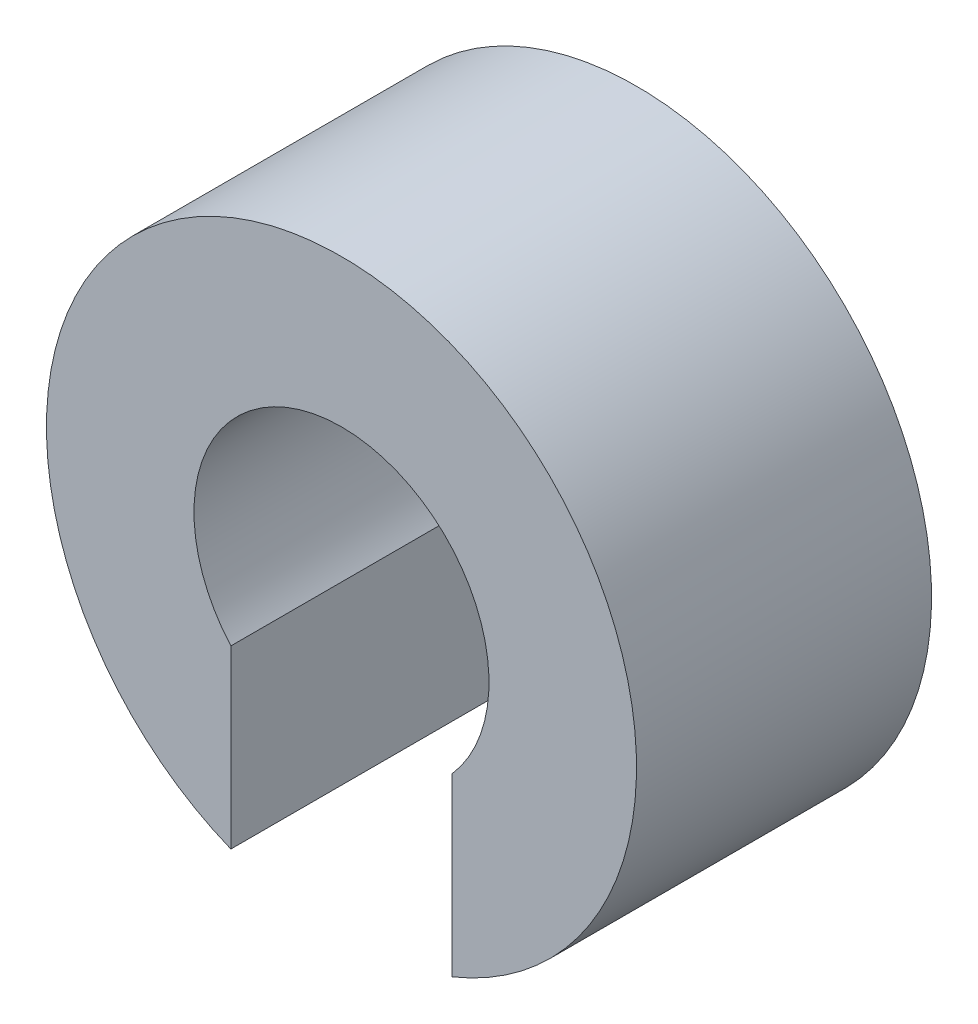
ISO-10303-21;
HEADER;
FILE_DESCRIPTION(('STEP AP214'),'2;1');
FILE_NAME('part.step','',(''),(''),'','','');
FILE_SCHEMA(('AUTOMOTIVE_DESIGN { 1 0 10303 214 1 1 1 1 }'));
ENDSEC;
DATA;
#1=APPLICATION_CONTEXT('core data for automotive mechanical design processes');
#2=APPLICATION_PROTOCOL_DEFINITION('international standard','automotive_design',2000,#1);
#3=PRODUCT_CONTEXT('',#1,'mechanical');
#4=PRODUCT('Part','Part','',(#3));
#5=PRODUCT_RELATED_PRODUCT_CATEGORY('part','',(#4));
#6=PRODUCT_DEFINITION_FORMATION('','',#4);
#7=PRODUCT_DEFINITION_CONTEXT('part definition',#1,'design');
#8=PRODUCT_DEFINITION('design','',#6,#7);
#9=PRODUCT_DEFINITION_SHAPE('','',#8);
#10=(LENGTH_UNIT() NAMED_UNIT(*) SI_UNIT(.MILLI.,.METRE.));
#11=(NAMED_UNIT(*) PLANE_ANGLE_UNIT() SI_UNIT($,.RADIAN.));
#12=(NAMED_UNIT(*) SI_UNIT($,.STERADIAN.) SOLID_ANGLE_UNIT());
#13=UNCERTAINTY_MEASURE_WITH_UNIT(LENGTH_MEASURE(1.E-05),#10,'distance_accuracy_value','');
#14=(GEOMETRIC_REPRESENTATION_CONTEXT(3) GLOBAL_UNCERTAINTY_ASSIGNED_CONTEXT((#13)) GLOBAL_UNIT_ASSIGNED_CONTEXT((#10,
#11,#12)) REPRESENTATION_CONTEXT('',''));
#15=CARTESIAN_POINT('',(0.,0.,0.));
#16=DIRECTION('',(0.,0.,1.));
#17=DIRECTION('',(1.,0.,0.));
#18=AXIS2_PLACEMENT_3D('',#15,#16,#17);
#19=CARTESIAN_POINT('',(0.,0.,4.));
#20=DIRECTION('',(0.,0.,1.));
#21=DIRECTION('',(1.,0.,0.));
#22=AXIS2_PLACEMENT_3D('',#19,#20,#21);
#23=PLANE('',#22);
#24=DIRECTION('',(0.,-1.,0.));
#25=VECTOR('',#24,1.);
#26=CARTESIAN_POINT('',(-1.5,-1.32287565553229,4.));
#27=LINE('',#26,#25);
#28=CARTESIAN_POINT('',(-1.5,-1.32287565553229,4.));
#29=VERTEX_POINT('',#28);
#30=CARTESIAN_POINT('',(-1.5,-3.70809924354783,4.));
#31=VERTEX_POINT('',#30);
#32=EDGE_CURVE('E407',#29,#31,#27,.T.);
#33=ORIENTED_EDGE('',*,*,#32,.F.);
#34=CARTESIAN_POINT('',(0.,0.,4.));
#35=DIRECTION('',(0.,0.,1.));
#36=DIRECTION('',(1.,0.,0.));
#37=AXIS2_PLACEMENT_3D('',#34,#35,#36);
#38=CIRCLE('',#37,2.);
#39=CARTESIAN_POINT('',(1.5,-1.32287565553229,4.));
#40=VERTEX_POINT('',#39);
#41=EDGE_CURVE('E418',#40,#29,#38,.T.);
#42=ORIENTED_EDGE('',*,*,#41,.F.);
#43=DIRECTION('',(0.,1.,0.));
#44=VECTOR('',#43,1.);
#45=CARTESIAN_POINT('',(1.5,-1.32287565553229,4.));
#46=LINE('',#45,#44);
#47=CARTESIAN_POINT('',(1.5,-3.70809924354783,4.));
#48=VERTEX_POINT('',#47);
#49=EDGE_CURVE('E389',#48,#40,#46,.T.);
#50=ORIENTED_EDGE('',*,*,#49,.F.);
#51=CARTESIAN_POINT('',(0.,0.,4.));
#52=DIRECTION('',(0.,0.,1.));
#53=DIRECTION('',(1.,0.,0.));
#54=AXIS2_PLACEMENT_3D('',#51,#52,#53);
#55=CIRCLE('',#54,4.);
#56=EDGE_CURVE('E11',#48,#31,#55,.T.);
#57=ORIENTED_EDGE('',*,*,#56,.T.);
#58=EDGE_LOOP('',(#33,#42,#50,#57));
#59=FACE_BOUND('',#58,.T.);
#60=ADVANCED_FACE('F366',(#59),#23,.T.);
#61=CARTESIAN_POINT('',(0.,0.,0.));
#62=DIRECTION('',(0.,0.,1.));
#63=DIRECTION('',(1.,0.,0.));
#64=AXIS2_PLACEMENT_3D('',#61,#62,#63);
#65=PLANE('',#64);
#66=CARTESIAN_POINT('',(0.,0.,0.));
#67=DIRECTION('',(0.,0.,1.));
#68=DIRECTION('',(1.,0.,0.));
#69=AXIS2_PLACEMENT_3D('',#66,#67,#68);
#70=CIRCLE('',#69,2.);
#71=CARTESIAN_POINT('',(1.5,-1.32287565553229,0.));
#72=VERTEX_POINT('',#71);
#73=CARTESIAN_POINT('',(-1.5,-1.32287565553229,0.));
#74=VERTEX_POINT('',#73);
#75=EDGE_CURVE('E422',#72,#74,#70,.T.);
#76=ORIENTED_EDGE('',*,*,#75,.T.);
#77=DIRECTION('',(0.,-1.,0.));
#78=VECTOR('',#77,1.);
#79=CARTESIAN_POINT('',(-1.5,-1.32287565553229,0.));
#80=LINE('',#79,#78);
#81=CARTESIAN_POINT('',(-1.5,-3.70809924354783,0.));
#82=VERTEX_POINT('',#81);
#83=EDGE_CURVE('E381',#74,#82,#80,.T.);
#84=ORIENTED_EDGE('',*,*,#83,.T.);
#85=CARTESIAN_POINT('',(0.,0.,0.));
#86=DIRECTION('',(0.,0.,1.));
#87=DIRECTION('',(1.,0.,0.));
#88=AXIS2_PLACEMENT_3D('',#85,#86,#87);
#89=CIRCLE('',#88,4.);
#90=CARTESIAN_POINT('',(1.5,-3.70809924354783,0.));
#91=VERTEX_POINT('',#90);
#92=EDGE_CURVE('E374',#91,#82,#89,.T.);
#93=ORIENTED_EDGE('',*,*,#92,.F.);
#94=DIRECTION('',(0.,1.,0.));
#95=VECTOR('',#94,1.);
#96=CARTESIAN_POINT('',(1.5,-1.32287565553229,0.));
#97=LINE('',#96,#95);
#98=EDGE_CURVE('E431',#91,#72,#97,.T.);
#99=ORIENTED_EDGE('',*,*,#98,.T.);
#100=EDGE_LOOP('',(#76,#84,#93,#99));
#101=FACE_BOUND('',#100,.T.);
#102=ADVANCED_FACE('F438',(#101),#65,.F.);
#103=CARTESIAN_POINT('',(0.,0.,4.));
#104=DIRECTION('',(0.,0.,-1.));
#105=DIRECTION('',(-1.,0.,0.));
#106=AXIS2_PLACEMENT_3D('',#103,#104,#105);
#107=CYLINDRICAL_SURFACE('',#106,4.);
#108=ORIENTED_EDGE('',*,*,#92,.T.);
#109=DIRECTION('',(0.,0.,-1.));
#110=VECTOR('',#109,1.);
#111=CARTESIAN_POINT('',(-1.5,-3.70809924354783,4.));
#112=LINE('',#111,#110);
#113=EDGE_CURVE('E425',#82,#31,#112,.F.);
#114=ORIENTED_EDGE('',*,*,#113,.T.);
#115=ORIENTED_EDGE('',*,*,#56,.F.);
#116=DIRECTION('',(0.,0.,-1.));
#117=VECTOR('',#116,1.);
#118=CARTESIAN_POINT('',(1.5,-3.70809924354783,4.));
#119=LINE('',#118,#117);
#120=EDGE_CURVE('E413',#48,#91,#119,.T.);
#121=ORIENTED_EDGE('',*,*,#120,.T.);
#122=EDGE_LOOP('',(#108,#114,#115,#121));
#123=FACE_BOUND('',#122,.T.);
#124=ADVANCED_FACE('F368',(#123),#107,.T.);
#125=CARTESIAN_POINT('',(0.,0.,4.));
#126=DIRECTION('',(0.,0.,-1.));
#127=DIRECTION('',(-1.,0.,0.));
#128=AXIS2_PLACEMENT_3D('',#125,#126,#127);
#129=CYLINDRICAL_SURFACE('',#128,2.);
#130=DIRECTION('',(0.,0.,1.));
#131=VECTOR('',#130,1.);
#132=CARTESIAN_POINT('',(-1.5,-1.32287565553229,0.));
#133=LINE('',#132,#131);
#134=EDGE_CURVE('E404',#74,#29,#133,.T.);
#135=ORIENTED_EDGE('',*,*,#134,.F.);
#136=ORIENTED_EDGE('',*,*,#75,.F.);
#137=DIRECTION('',(0.,0.,1.));
#138=VECTOR('',#137,1.);
#139=CARTESIAN_POINT('',(1.5,-1.32287565553229,0.));
#140=LINE('',#139,#138);
#141=EDGE_CURVE('E414',#72,#40,#140,.T.);
#142=ORIENTED_EDGE('',*,*,#141,.T.);
#143=ORIENTED_EDGE('',*,*,#41,.T.);
#144=EDGE_LOOP('',(#135,#136,#142,#143));
#145=FACE_BOUND('',#144,.T.);
#146=ADVANCED_FACE('F421',(#145),#129,.F.);
#147=CARTESIAN_POINT('',(1.5,-1.32287565553229,0.));
#148=DIRECTION('',(1.,0.,0.));
#149=DIRECTION('',(0.,1.,0.));
#150=AXIS2_PLACEMENT_3D('',#147,#148,#149);
#151=PLANE('',#150);
#152=ORIENTED_EDGE('',*,*,#49,.T.);
#153=ORIENTED_EDGE('',*,*,#141,.F.);
#154=ORIENTED_EDGE('',*,*,#98,.F.);
#155=ORIENTED_EDGE('',*,*,#120,.F.);
#156=EDGE_LOOP('',(#152,#153,#154,#155));
#157=FACE_BOUND('',#156,.T.);
#158=ADVANCED_FACE('F440',(#157),#151,.F.);
#159=CARTESIAN_POINT('',(-1.5,-1.32287565553229,0.));
#160=DIRECTION('',(-1.,0.,0.));
#161=DIRECTION('',(0.,-1.,0.));
#162=AXIS2_PLACEMENT_3D('',#159,#160,#161);
#163=PLANE('',#162);
#164=ORIENTED_EDGE('',*,*,#83,.F.);
#165=ORIENTED_EDGE('',*,*,#134,.T.);
#166=ORIENTED_EDGE('',*,*,#32,.T.);
#167=ORIENTED_EDGE('',*,*,#113,.F.);
#168=EDGE_LOOP('',(#164,#165,#166,#167));
#169=FACE_BOUND('',#168,.T.);
#170=ADVANCED_FACE('F406',(#169),#163,.F.);
#171=CLOSED_SHELL('',(#60,#102,#124,#146,#158,#170));
#172=MANIFOLD_SOLID_BREP('B2',#171);
#173=ADVANCED_BREP_SHAPE_REPRESENTATION('',(#18,#172),#14);
#174=SHAPE_DEFINITION_REPRESENTATION(#9,#173);
ENDSEC;
END-ISO-10303-21;
